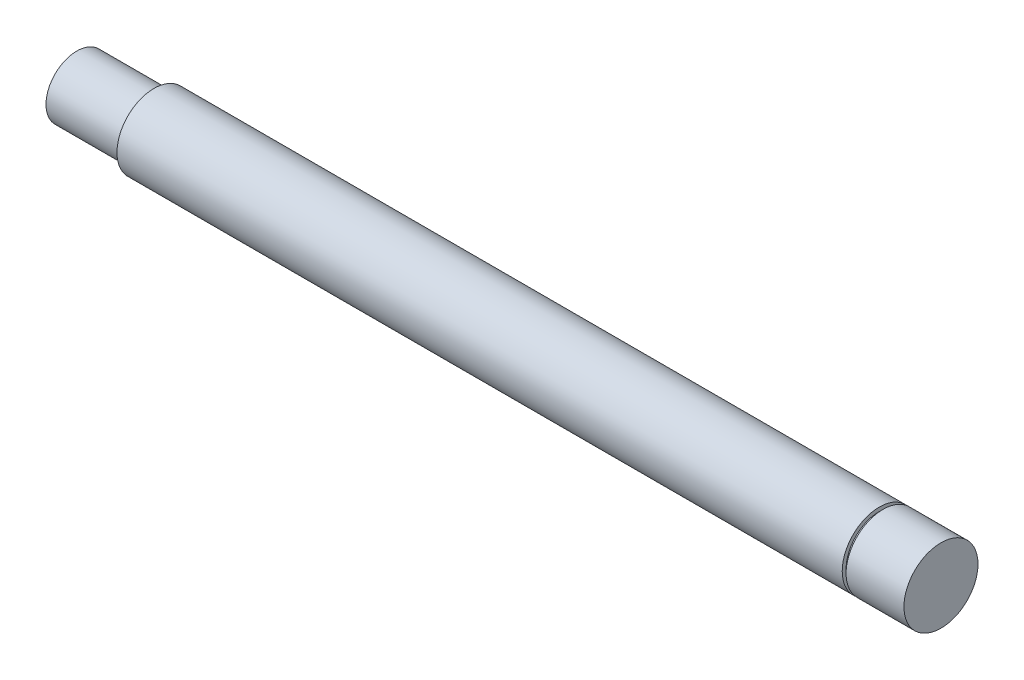
ISO-10303-21;
HEADER;
FILE_DESCRIPTION(('STEP AP214'),'2;1');
FILE_NAME('part.step','',(''),(''),'','','');
FILE_SCHEMA(('AUTOMOTIVE_DESIGN { 1 0 10303 214 1 1 1 1 }'));
ENDSEC;
DATA;
#1=APPLICATION_CONTEXT('core data for automotive mechanical design processes');
#2=APPLICATION_PROTOCOL_DEFINITION('international standard','automotive_design',2000,#1);
#3=PRODUCT_CONTEXT('',#1,'mechanical');
#4=PRODUCT('Part','Part','',(#3));
#5=PRODUCT_RELATED_PRODUCT_CATEGORY('part','',(#4));
#6=PRODUCT_DEFINITION_FORMATION('','',#4);
#7=PRODUCT_DEFINITION_CONTEXT('part definition',#1,'design');
#8=PRODUCT_DEFINITION('design','',#6,#7);
#9=PRODUCT_DEFINITION_SHAPE('','',#8);
#10=(LENGTH_UNIT() NAMED_UNIT(*) SI_UNIT(.MILLI.,.METRE.));
#11=(NAMED_UNIT(*) PLANE_ANGLE_UNIT() SI_UNIT($,.RADIAN.));
#12=(NAMED_UNIT(*) SI_UNIT($,.STERADIAN.) SOLID_ANGLE_UNIT());
#13=UNCERTAINTY_MEASURE_WITH_UNIT(LENGTH_MEASURE(1.E-05),#10,'distance_accuracy_value','');
#14=(GEOMETRIC_REPRESENTATION_CONTEXT(3) GLOBAL_UNCERTAINTY_ASSIGNED_CONTEXT((#13)) GLOBAL_UNIT_ASSIGNED_CONTEXT((#10,
#11,#12)) REPRESENTATION_CONTEXT('',''));
#15=CARTESIAN_POINT('',(0.,0.,0.));
#16=DIRECTION('',(0.,0.,1.));
#17=DIRECTION('',(1.,0.,0.));
#18=AXIS2_PLACEMENT_3D('',#15,#16,#17);
#19=CARTESIAN_POINT('',(177.8,0.,0.));
#20=DIRECTION('',(-1.,0.,0.));
#21=DIRECTION('',(0.,0.,1.));
#22=AXIS2_PLACEMENT_3D('',#19,#20,#21);
#23=CYLINDRICAL_SURFACE('',#22,7.62);
#24=CARTESIAN_POINT('',(165.1,0.,0.));
#25=DIRECTION('',(1.,0.,0.));
#26=DIRECTION('',(0.,0.,-1.));
#27=AXIS2_PLACEMENT_3D('',#24,#25,#26);
#28=CIRCLE('',#27,7.62);
#29=CARTESIAN_POINT('',(165.1,0.,-7.62));
#30=VERTEX_POINT('',#29);
#31=EDGE_CURVE('E39',#30,#30,#28,.T.);
#32=ORIENTED_EDGE('',*,*,#31,.F.);
#33=EDGE_LOOP('',(#32));
#34=FACE_BOUND('',#33,.T.);
#35=CARTESIAN_POINT('',(15.875,0.,0.));
#36=DIRECTION('',(-1.,0.,0.));
#37=DIRECTION('',(0.,0.,1.));
#38=AXIS2_PLACEMENT_3D('',#35,#36,#37);
#39=CIRCLE('',#38,7.62);
#40=CARTESIAN_POINT('',(15.875,0.,7.62));
#41=VERTEX_POINT('',#40);
#42=EDGE_CURVE('E53',#41,#41,#39,.T.);
#43=ORIENTED_EDGE('',*,*,#42,.F.);
#44=EDGE_LOOP('',(#43));
#45=FACE_BOUND('',#44,.T.);
#46=ADVANCED_FACE('F32',(#34,#45),#23,.T.);
#47=CARTESIAN_POINT('',(165.1,0.,0.));
#48=DIRECTION('',(1.,0.,0.));
#49=DIRECTION('',(0.,0.,-1.));
#50=AXIS2_PLACEMENT_3D('',#47,#48,#49);
#51=PLANE('',#50);
#52=CARTESIAN_POINT('',(165.1,0.,0.));
#53=DIRECTION('',(1.,0.,0.));
#54=DIRECTION('',(0.,0.,-1.));
#55=AXIS2_PLACEMENT_3D('',#52,#53,#54);
#56=CIRCLE('',#55,6.82625);
#57=CARTESIAN_POINT('',(165.1,0.,-6.82625));
#58=VERTEX_POINT('',#57);
#59=EDGE_CURVE('E48',#58,#58,#56,.T.);
#60=ORIENTED_EDGE('',*,*,#59,.F.);
#61=EDGE_LOOP('',(#60));
#62=FACE_BOUND('',#61,.T.);
#63=ORIENTED_EDGE('',*,*,#31,.T.);
#64=EDGE_LOOP('',(#63));
#65=FACE_BOUND('',#64,.T.);
#66=ADVANCED_FACE('F75',(#62,#65),#51,.T.);
#67=CARTESIAN_POINT('',(165.89375,0.,0.));
#68=DIRECTION('',(1.,0.,0.));
#69=DIRECTION('',(0.,0.,-1.));
#70=AXIS2_PLACEMENT_3D('',#67,#68,#69);
#71=PLANE('',#70);
#72=CARTESIAN_POINT('',(165.89375,0.,0.));
#73=DIRECTION('',(1.,0.,0.));
#74=DIRECTION('',(0.,0.,-1.));
#75=AXIS2_PLACEMENT_3D('',#72,#73,#74);
#76=CIRCLE('',#75,6.82625);
#77=CARTESIAN_POINT('',(165.89375,0.,-6.82625));
#78=VERTEX_POINT('',#77);
#79=EDGE_CURVE('E50',#78,#78,#76,.T.);
#80=ORIENTED_EDGE('',*,*,#79,.T.);
#81=EDGE_LOOP('',(#80));
#82=FACE_BOUND('',#81,.T.);
#83=CARTESIAN_POINT('',(165.89375,0.,0.));
#84=DIRECTION('',(1.,0.,0.));
#85=DIRECTION('',(0.,0.,-1.));
#86=AXIS2_PLACEMENT_3D('',#83,#84,#85);
#87=CIRCLE('',#86,7.62);
#88=CARTESIAN_POINT('',(165.89375,0.,-7.62));
#89=VERTEX_POINT('',#88);
#90=EDGE_CURVE('E43',#89,#89,#87,.T.);
#91=ORIENTED_EDGE('',*,*,#90,.F.);
#92=EDGE_LOOP('',(#91));
#93=FACE_BOUND('',#92,.T.);
#94=ADVANCED_FACE('F80',(#82,#93),#71,.F.);
#95=CARTESIAN_POINT('',(165.1,0.,0.));
#96=DIRECTION('',(1.,0.,0.));
#97=DIRECTION('',(0.,0.,-1.));
#98=AXIS2_PLACEMENT_3D('',#95,#96,#97);
#99=CYLINDRICAL_SURFACE('',#98,6.82625);
#100=ORIENTED_EDGE('',*,*,#59,.T.);
#101=EDGE_LOOP('',(#100));
#102=FACE_BOUND('',#101,.T.);
#103=ORIENTED_EDGE('',*,*,#79,.F.);
#104=EDGE_LOOP('',(#103));
#105=FACE_BOUND('',#104,.T.);
#106=ADVANCED_FACE('F89',(#102,#105),#99,.T.);
#107=CARTESIAN_POINT('',(177.8,0.,0.));
#108=DIRECTION('',(1.,0.,0.));
#109=DIRECTION('',(0.,0.,-1.));
#110=AXIS2_PLACEMENT_3D('',#107,#108,#109);
#111=PLANE('',#110);
#112=CARTESIAN_POINT('',(177.8,0.,0.));
#113=DIRECTION('',(1.,0.,0.));
#114=DIRECTION('',(0.,0.,-1.));
#115=AXIS2_PLACEMENT_3D('',#112,#113,#114);
#116=CIRCLE('',#115,7.62);
#117=CARTESIAN_POINT('',(177.8,0.,-7.62));
#118=VERTEX_POINT('',#117);
#119=EDGE_CURVE('E10',#118,#118,#116,.T.);
#120=ORIENTED_EDGE('',*,*,#119,.T.);
#121=EDGE_LOOP('',(#120));
#122=FACE_BOUND('',#121,.T.);
#123=ADVANCED_FACE('F84',(#122),#111,.T.);
#124=ORIENTED_EDGE('',*,*,#90,.T.);
#125=EDGE_LOOP('',(#124));
#126=FACE_BOUND('',#125,.T.);
#127=ORIENTED_EDGE('',*,*,#119,.F.);
#128=EDGE_LOOP('',(#127));
#129=FACE_BOUND('',#128,.T.);
#130=ADVANCED_FACE('F34',(#126,#129),#23,.T.);
#131=CARTESIAN_POINT('',(15.875,0.,0.));
#132=DIRECTION('',(-1.,0.,0.));
#133=DIRECTION('',(0.,0.,1.));
#134=AXIS2_PLACEMENT_3D('',#131,#132,#133);
#135=PLANE('',#134);
#136=CARTESIAN_POINT('',(15.875,0.,0.));
#137=DIRECTION('',(-1.,0.,0.));
#138=DIRECTION('',(0.,0.,1.));
#139=AXIS2_PLACEMENT_3D('',#136,#137,#138);
#140=CIRCLE('',#139,6.35);
#141=CARTESIAN_POINT('',(15.875,0.,6.35));
#142=VERTEX_POINT('',#141);
#143=EDGE_CURVE('E58',#142,#142,#140,.T.);
#144=ORIENTED_EDGE('',*,*,#143,.F.);
#145=EDGE_LOOP('',(#144));
#146=FACE_BOUND('',#145,.T.);
#147=ORIENTED_EDGE('',*,*,#42,.T.);
#148=EDGE_LOOP('',(#147));
#149=FACE_BOUND('',#148,.T.);
#150=ADVANCED_FACE('F68',(#146,#149),#135,.T.);
#151=CARTESIAN_POINT('',(15.875,0.,0.));
#152=DIRECTION('',(-1.,0.,0.));
#153=DIRECTION('',(0.,0.,1.));
#154=AXIS2_PLACEMENT_3D('',#151,#152,#153);
#155=CYLINDRICAL_SURFACE('',#154,6.35);
#156=ORIENTED_EDGE('',*,*,#143,.T.);
#157=EDGE_LOOP('',(#156));
#158=FACE_BOUND('',#157,.T.);
#159=CARTESIAN_POINT('',(0.,0.,0.));
#160=DIRECTION('',(-1.,0.,0.));
#161=DIRECTION('',(0.,0.,1.));
#162=AXIS2_PLACEMENT_3D('',#159,#160,#161);
#163=CIRCLE('',#162,6.35);
#164=CARTESIAN_POINT('',(0.,0.,6.35));
#165=VERTEX_POINT('',#164);
#166=EDGE_CURVE('E59',#165,#165,#163,.T.);
#167=ORIENTED_EDGE('',*,*,#166,.F.);
#168=EDGE_LOOP('',(#167));
#169=FACE_BOUND('',#168,.T.);
#170=ADVANCED_FACE('F65',(#158,#169),#155,.T.);
#171=CARTESIAN_POINT('',(0.,0.,0.));
#172=DIRECTION('',(1.,0.,0.));
#173=DIRECTION('',(0.,0.,-1.));
#174=AXIS2_PLACEMENT_3D('',#171,#172,#173);
#175=PLANE('',#174);
#176=ORIENTED_EDGE('',*,*,#166,.T.);
#177=EDGE_LOOP('',(#176));
#178=FACE_BOUND('',#177,.T.);
#179=ADVANCED_FACE('F102',(#178),#175,.F.);
#180=CLOSED_SHELL('',(#46,#66,#94,#106,#123,#130,#150,#170,#179));
#181=MANIFOLD_SOLID_BREP('B2',#180);
#182=ADVANCED_BREP_SHAPE_REPRESENTATION('',(#18,#181),#14);
#183=SHAPE_DEFINITION_REPRESENTATION(#9,#182);
ENDSEC;
END-ISO-10303-21;
